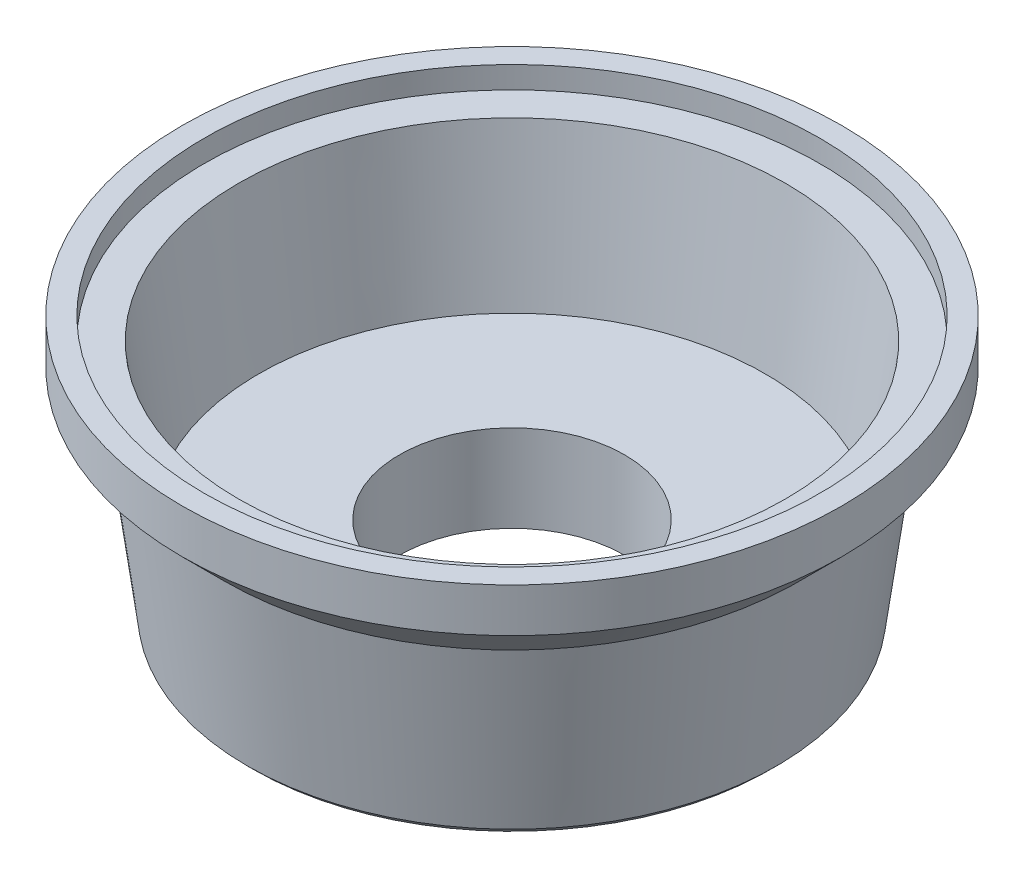
ISO-10303-21;
HEADER;
FILE_DESCRIPTION(('STEP AP214'),'2;1');
FILE_NAME('part.step','',(''),(''),'','','');
FILE_SCHEMA(('AUTOMOTIVE_DESIGN { 1 0 10303 214 1 1 1 1 }'));
ENDSEC;
DATA;
#1=APPLICATION_CONTEXT('core data for automotive mechanical design processes');
#2=APPLICATION_PROTOCOL_DEFINITION('international standard','automotive_design',2000,#1);
#3=PRODUCT_CONTEXT('',#1,'mechanical');
#4=PRODUCT('Part','Part','',(#3));
#5=PRODUCT_RELATED_PRODUCT_CATEGORY('part','',(#4));
#6=PRODUCT_DEFINITION_FORMATION('','',#4);
#7=PRODUCT_DEFINITION_CONTEXT('part definition',#1,'design');
#8=PRODUCT_DEFINITION('design','',#6,#7);
#9=PRODUCT_DEFINITION_SHAPE('','',#8);
#10=(LENGTH_UNIT() NAMED_UNIT(*) SI_UNIT(.MILLI.,.METRE.));
#11=(NAMED_UNIT(*) PLANE_ANGLE_UNIT() SI_UNIT($,.RADIAN.));
#12=(NAMED_UNIT(*) SI_UNIT($,.STERADIAN.) SOLID_ANGLE_UNIT());
#13=UNCERTAINTY_MEASURE_WITH_UNIT(LENGTH_MEASURE(1.E-05),#10,'distance_accuracy_value','');
#14=(GEOMETRIC_REPRESENTATION_CONTEXT(3) GLOBAL_UNCERTAINTY_ASSIGNED_CONTEXT((#13)) GLOBAL_UNIT_ASSIGNED_CONTEXT((#10,
#11,#12)) REPRESENTATION_CONTEXT('',''));
#15=CARTESIAN_POINT('',(0.,0.,0.));
#16=DIRECTION('',(0.,0.,1.));
#17=DIRECTION('',(1.,0.,0.));
#18=AXIS2_PLACEMENT_3D('',#15,#16,#17);
#19=CARTESIAN_POINT('',(0.,0.,0.));
#20=DIRECTION('',(0.,1.,0.));
#21=DIRECTION('',(0.,0.,1.));
#22=AXIS2_PLACEMENT_3D('',#19,#20,#21);
#23=PLANE('',#22);
#24=CARTESIAN_POINT('',(0.,0.,0.));
#25=DIRECTION('',(0.,1.,0.));
#26=DIRECTION('',(0.,0.,1.));
#27=AXIS2_PLACEMENT_3D('',#24,#25,#26);
#28=CIRCLE('',#27,18.6842399999999);
#29=CARTESIAN_POINT('',(0.,0.,18.6842399999999));
#30=VERTEX_POINT('',#29);
#31=EDGE_CURVE('E55',#30,#30,#28,.F.);
#32=ORIENTED_EDGE('',*,*,#31,.T.);
#33=EDGE_LOOP('',(#32));
#34=FACE_BOUND('',#33,.T.);
#35=CARTESIAN_POINT('',(0.,0.,0.));
#36=DIRECTION('',(0.,1.,0.));
#37=DIRECTION('',(0.,0.,1.));
#38=AXIS2_PLACEMENT_3D('',#35,#36,#37);
#39=CIRCLE('',#38,16.27124);
#40=CARTESIAN_POINT('',(0.,0.,16.27124));
#41=VERTEX_POINT('',#40);
#42=EDGE_CURVE('E75',#41,#41,#39,.T.);
#43=ORIENTED_EDGE('',*,*,#42,.T.);
#44=EDGE_LOOP('',(#43));
#45=FACE_BOUND('',#44,.T.);
#46=ADVANCED_FACE('F43',(#34,#45),#23,.F.);
#47=CARTESIAN_POINT('',(0.,0.,0.));
#48=DIRECTION('',(0.,1.,0.));
#49=DIRECTION('',(0.,0.,1.));
#50=AXIS2_PLACEMENT_3D('',#47,#48,#49);
#51=CIRCLE('',#50,37.338);
#52=CARTESIAN_POINT('',(0.,0.,37.338));
#53=VERTEX_POINT('',#52);
#54=EDGE_CURVE('E10',#53,#53,#51,.F.);
#55=ORIENTED_EDGE('',*,*,#54,.T.);
#56=EDGE_LOOP('',(#55));
#57=FACE_BOUND('',#56,.T.);
#58=CARTESIAN_POINT('',(0.,0.,0.));
#59=DIRECTION('',(0.,1.,0.));
#60=DIRECTION('',(0.,0.,1.));
#61=AXIS2_PLACEMENT_3D('',#58,#59,#60);
#62=CIRCLE('',#61,34.8974859273679);
#63=CARTESIAN_POINT('',(0.,0.,34.8974859273679));
#64=VERTEX_POINT('',#63);
#65=EDGE_CURVE('E88',#64,#64,#62,.T.);
#66=ORIENTED_EDGE('',*,*,#65,.T.);
#67=EDGE_LOOP('',(#66));
#68=FACE_BOUND('',#67,.T.);
#69=ADVANCED_FACE('F113',(#57,#68),#23,.F.);
#70=CARTESIAN_POINT('',(0.,0.,0.));
#71=DIRECTION('',(0.,1.,0.));
#72=DIRECTION('',(0.,0.,1.));
#73=AXIS2_PLACEMENT_3D('',#70,#71,#72);
#74=CONICAL_SURFACE('',#73,38.1,0.131177194417784);
#75=CARTESIAN_POINT('',(0.,0.877814265508203,0.));
#76=DIRECTION('',(0.,-1.,0.));
#77=DIRECTION('',(0.,0.,-1.));
#78=AXIS2_PLACEMENT_3D('',#75,#76,#77);
#79=CIRCLE('',#78,38.2158142655082);
#80=CARTESIAN_POINT('',(0.,0.877814265508203,38.2158142655082));
#81=VERTEX_POINT('',#80);
#82=EDGE_CURVE('E51',#81,#81,#79,.F.);
#83=ORIENTED_EDGE('',*,*,#82,.T.);
#84=EDGE_LOOP('',(#83));
#85=FACE_BOUND('',#84,.T.);
#86=CARTESIAN_POINT('',(0.,25.602916077322,0.));
#87=DIRECTION('',(0.,1.,0.));
#88=DIRECTION('',(0.,0.,1.));
#89=AXIS2_PLACEMENT_3D('',#86,#87,#88);
#90=CIRCLE('',#89,41.477916077322);
#91=CARTESIAN_POINT('',(0.,25.602916077322,41.477916077322));
#92=VERTEX_POINT('',#91);
#93=EDGE_CURVE('E94',#92,#92,#90,.F.);
#94=ORIENTED_EDGE('',*,*,#93,.T.);
#95=EDGE_LOOP('',(#94));
#96=FACE_BOUND('',#95,.T.);
#97=ADVANCED_FACE('F111',(#85,#96),#74,.T.);
#98=CARTESIAN_POINT('',(0.,0.,0.));
#99=DIRECTION('',(0.,1.,0.));
#100=DIRECTION('',(0.,0.,1.));
#101=AXIS2_PLACEMENT_3D('',#98,#99,#100);
#102=CYLINDRICAL_SURFACE('',#101,47.625);
#103=CARTESIAN_POINT('',(0.,38.1,0.));
#104=DIRECTION('',(0.,1.,0.));
#105=DIRECTION('',(0.,0.,1.));
#106=AXIS2_PLACEMENT_3D('',#103,#104,#105);
#107=CIRCLE('',#106,47.625);
#108=CARTESIAN_POINT('',(0.,38.1,47.625));
#109=VERTEX_POINT('',#108);
#110=EDGE_CURVE('E67',#109,#109,#107,.T.);
#111=ORIENTED_EDGE('',*,*,#110,.F.);
#112=EDGE_LOOP('',(#111));
#113=FACE_BOUND('',#112,.T.);
#114=CARTESIAN_POINT('',(0.,31.75,0.));
#115=DIRECTION('',(0.,1.,0.));
#116=DIRECTION('',(0.,0.,1.));
#117=AXIS2_PLACEMENT_3D('',#114,#115,#116);
#118=CIRCLE('',#117,47.625);
#119=CARTESIAN_POINT('',(0.,31.75,47.625));
#120=VERTEX_POINT('',#119);
#121=EDGE_CURVE('E97',#120,#120,#118,.T.);
#122=ORIENTED_EDGE('',*,*,#121,.T.);
#123=EDGE_LOOP('',(#122));
#124=FACE_BOUND('',#123,.T.);
#125=ADVANCED_FACE('F101',(#113,#124),#102,.T.);
#126=CARTESIAN_POINT('',(0.,38.1,-47.625));
#127=DIRECTION('',(0.,-1.,0.));
#128=DIRECTION('',(0.,0.,-1.));
#129=AXIS2_PLACEMENT_3D('',#126,#127,#128);
#130=PLANE('',#129);
#131=CARTESIAN_POINT('',(0.,38.1,0.));
#132=DIRECTION('',(0.,-1.,0.));
#133=DIRECTION('',(0.,0.,-1.));
#134=AXIS2_PLACEMENT_3D('',#131,#132,#133);
#135=CIRCLE('',#134,44.45);
#136=CARTESIAN_POINT('',(0.,38.1,-44.45));
#137=VERTEX_POINT('',#136);
#138=EDGE_CURVE('E71',#137,#137,#135,.F.);
#139=ORIENTED_EDGE('',*,*,#138,.F.);
#140=EDGE_LOOP('',(#139));
#141=FACE_BOUND('',#140,.T.);
#142=ORIENTED_EDGE('',*,*,#110,.T.);
#143=EDGE_LOOP('',(#142));
#144=FACE_BOUND('',#143,.T.);
#145=ADVANCED_FACE('F119',(#141,#144),#130,.F.);
#146=CARTESIAN_POINT('',(0.,0.415294170850315,0.));
#147=DIRECTION('',(0.,1.,0.));
#148=DIRECTION('',(0.,0.,1.));
#149=AXIS2_PLACEMENT_3D('',#146,#147,#148);
#150=CONICAL_SURFACE('',#149,34.9522776882867,0.131177194417784);
#151=CARTESIAN_POINT('',(0.,12.5719302661163,0.));
#152=DIRECTION('',(0.,1.,0.));
#153=DIRECTION('',(0.,0.,1.));
#154=AXIS2_PLACEMENT_3D('',#151,#152,#153);
#155=CIRCLE('',#154,36.5561612610929);
#156=CARTESIAN_POINT('',(0.,12.5719302661163,36.5561612610929));
#157=VERTEX_POINT('',#156);
#158=EDGE_CURVE('E64',#157,#157,#155,.T.);
#159=ORIENTED_EDGE('',*,*,#158,.F.);
#160=EDGE_LOOP('',(#159));
#161=FACE_BOUND('',#160,.T.);
#162=CARTESIAN_POINT('',(0.,34.925,0.));
#163=DIRECTION('',(0.,1.,0.));
#164=DIRECTION('',(0.,0.,1.));
#165=AXIS2_PLACEMENT_3D('',#162,#163,#164);
#166=CIRCLE('',#165,39.505309452008);
#167=CARTESIAN_POINT('',(0.,34.925,39.505309452008));
#168=VERTEX_POINT('',#167);
#169=EDGE_CURVE('E70',#168,#168,#166,.T.);
#170=ORIENTED_EDGE('',*,*,#169,.T.);
#171=EDGE_LOOP('',(#170));
#172=FACE_BOUND('',#171,.T.);
#173=ADVANCED_FACE('F170',(#161,#172),#150,.F.);
#174=CARTESIAN_POINT('',(0.,34.925,-42.2889304769456));
#175=DIRECTION('',(0.,1.,0.));
#176=DIRECTION('',(0.,0.,1.));
#177=AXIS2_PLACEMENT_3D('',#174,#175,#176);
#178=PLANE('',#177);
#179=CARTESIAN_POINT('',(0.,34.925,0.));
#180=DIRECTION('',(0.,1.,0.));
#181=DIRECTION('',(0.,0.,1.));
#182=AXIS2_PLACEMENT_3D('',#179,#180,#181);
#183=CIRCLE('',#182,44.45);
#184=CARTESIAN_POINT('',(0.,34.925,44.45));
#185=VERTEX_POINT('',#184);
#186=EDGE_CURVE('E74',#185,#185,#183,.T.);
#187=ORIENTED_EDGE('',*,*,#186,.T.);
#188=EDGE_LOOP('',(#187));
#189=FACE_BOUND('',#188,.T.);
#190=ORIENTED_EDGE('',*,*,#169,.F.);
#191=EDGE_LOOP('',(#190));
#192=FACE_BOUND('',#191,.T.);
#193=ADVANCED_FACE('F173',(#189,#192),#178,.T.);
#194=CARTESIAN_POINT('',(0.,0.,0.));
#195=DIRECTION('',(0.,1.,0.));
#196=DIRECTION('',(0.,0.,1.));
#197=AXIS2_PLACEMENT_3D('',#194,#195,#196);
#198=CYLINDRICAL_SURFACE('',#197,44.45);
#199=ORIENTED_EDGE('',*,*,#138,.T.);
#200=EDGE_LOOP('',(#199));
#201=FACE_BOUND('',#200,.T.);
#202=ORIENTED_EDGE('',*,*,#186,.F.);
#203=EDGE_LOOP('',(#202));
#204=FACE_BOUND('',#203,.T.);
#205=ADVANCED_FACE('F168',(#201,#204),#198,.F.);
#206=CARTESIAN_POINT('',(-37.2773135563836,12.5719302661163,0.));
#207=DIRECTION('',(0.,1.,0.));
#208=DIRECTION('',(0.,0.,1.));
#209=AXIS2_PLACEMENT_3D('',#206,#207,#208);
#210=PLANE('',#209);
#211=CARTESIAN_POINT('',(0.,12.5719302661163,0.));
#212=DIRECTION('',(0.,1.,0.));
#213=DIRECTION('',(0.,0.,1.));
#214=AXIS2_PLACEMENT_3D('',#211,#212,#213);
#215=CIRCLE('',#214,16.27124);
#216=CARTESIAN_POINT('',(0.,12.5719302661163,16.27124));
#217=VERTEX_POINT('',#216);
#218=EDGE_CURVE('E80',#217,#217,#215,.T.);
#219=ORIENTED_EDGE('',*,*,#218,.F.);
#220=EDGE_LOOP('',(#219));
#221=FACE_BOUND('',#220,.T.);
#222=ORIENTED_EDGE('',*,*,#158,.T.);
#223=EDGE_LOOP('',(#222));
#224=FACE_BOUND('',#223,.T.);
#225=ADVANCED_FACE('F164',(#221,#224),#210,.T.);
#226=CARTESIAN_POINT('',(0.,0.,0.));
#227=DIRECTION('',(0.,1.,0.));
#228=DIRECTION('',(0.,0.,1.));
#229=AXIS2_PLACEMENT_3D('',#226,#227,#228);
#230=CYLINDRICAL_SURFACE('',#229,16.27124);
#231=CARTESIAN_POINT('',(0.,0.,16.27124));
#232=CARTESIAN_POINT('',(0.,0.130957606938711,16.27124));
#233=CARTESIAN_POINT('',(0.,0.261915213877422,16.27124));
#234=CARTESIAN_POINT('',(0.,0.523830427754845,16.27124));
#235=CARTESIAN_POINT('',(0.,0.654788034693556,16.27124));
#236=CARTESIAN_POINT('',(0.,0.916703248570978,16.27124));
#237=CARTESIAN_POINT('',(0.,1.04766085550969,16.27124));
#238=CARTESIAN_POINT('',(0.,1.30957606938711,16.27124));
#239=CARTESIAN_POINT('',(0.,1.44053367632582,16.27124));
#240=CARTESIAN_POINT('',(0.,1.70244889020324,16.27124));
#241=CARTESIAN_POINT('',(0.,1.83340649714196,16.27124));
#242=CARTESIAN_POINT('',(0.,2.09532171101938,16.27124));
#243=CARTESIAN_POINT('',(0.,2.22627931795809,16.27124));
#244=CARTESIAN_POINT('',(0.,2.48819453183551,16.27124));
#245=CARTESIAN_POINT('',(0.,2.61915213877422,16.27124));
#246=CARTESIAN_POINT('',(0.,2.88106735265164,16.27124));
#247=CARTESIAN_POINT('',(0.,3.01202495959036,16.27124));
#248=CARTESIAN_POINT('',(0.,3.27394017346778,16.27124));
#249=CARTESIAN_POINT('',(0.,3.40489778040649,16.27124));
#250=CARTESIAN_POINT('',(0.,3.66681299428391,16.27124));
#251=CARTESIAN_POINT('',(0.,3.79777060122262,16.27124));
#252=CARTESIAN_POINT('',(0.,4.05968581510005,16.27124));
#253=CARTESIAN_POINT('',(0.,4.19064342203876,16.27124));
#254=CARTESIAN_POINT('',(0.,4.45255863591618,16.27124));
#255=CARTESIAN_POINT('',(0.,4.58351624285489,16.27124));
#256=CARTESIAN_POINT('',(0.,4.84543145673231,16.27124));
#257=CARTESIAN_POINT('',(0.,4.97638906367102,16.27124));
#258=CARTESIAN_POINT('',(0.,5.23830427754844,16.27124));
#259=CARTESIAN_POINT('',(0.,5.36926188448716,16.27124));
#260=CARTESIAN_POINT('',(0.,5.63117709836458,16.27124));
#261=CARTESIAN_POINT('',(0.,5.76213470530329,16.27124));
#262=CARTESIAN_POINT('',(0.,6.02404991918071,16.27124));
#263=CARTESIAN_POINT('',(0.,6.15500752611942,16.27124));
#264=CARTESIAN_POINT('',(0.,6.41692273999685,16.27124));
#265=CARTESIAN_POINT('',(0.,6.54788034693556,16.27124));
#266=CARTESIAN_POINT('',(0.,6.80979556081298,16.27124));
#267=CARTESIAN_POINT('',(0.,6.94075316775169,16.27124));
#268=CARTESIAN_POINT('',(0.,7.20266838162911,16.27124));
#269=CARTESIAN_POINT('',(0.,7.33362598856782,16.27124));
#270=CARTESIAN_POINT('',(0.,7.59554120244525,16.27124));
#271=CARTESIAN_POINT('',(0.,7.72649880938396,16.27124));
#272=CARTESIAN_POINT('',(0.,7.98841402326138,16.27124));
#273=CARTESIAN_POINT('',(0.,8.11937163020009,16.27124));
#274=CARTESIAN_POINT('',(0.,8.38128684407751,16.27124));
#275=CARTESIAN_POINT('',(0.,8.51224445101622,16.27124));
#276=CARTESIAN_POINT('',(0.,8.77415966489365,16.27124));
#277=CARTESIAN_POINT('',(0.,8.90511727183236,16.27124));
#278=CARTESIAN_POINT('',(0.,9.16703248570978,16.27124));
#279=CARTESIAN_POINT('',(0.,9.29799009264849,16.27124));
#280=CARTESIAN_POINT('',(0.,9.55990530652591,16.27124));
#281=CARTESIAN_POINT('',(0.,9.69086291346462,16.27124));
#282=CARTESIAN_POINT('',(0.,9.95277812734204,16.27124));
#283=CARTESIAN_POINT('',(0.,10.0837357342808,16.27124));
#284=CARTESIAN_POINT('',(0.,10.3456509481582,16.27124));
#285=CARTESIAN_POINT('',(0.,10.4766085550969,16.27124));
#286=CARTESIAN_POINT('',(0.,10.7385237689743,16.27124));
#287=CARTESIAN_POINT('',(0.,10.869481375913,16.27124));
#288=CARTESIAN_POINT('',(0.,11.1313965897904,16.27124));
#289=CARTESIAN_POINT('',(0.,11.2623541967292,16.27124));
#290=CARTESIAN_POINT('',(0.,11.5242694106066,16.27124));
#291=CARTESIAN_POINT('',(0.,11.6552270175453,16.27124));
#292=CARTESIAN_POINT('',(0.,11.9171422314227,16.27124));
#293=CARTESIAN_POINT('',(0.,12.0480998383614,16.27124));
#294=CARTESIAN_POINT('',(0.,12.3100150522388,16.27124));
#295=CARTESIAN_POINT('',(0.,12.4409726591776,16.27124));
#296=CARTESIAN_POINT('',(0.,12.5719302661163,16.27124));
#297=B_SPLINE_CURVE_WITH_KNOTS('',3,(#231,#232,#233,#234,#235,#236,#237,#238,#239,#240,#241,
#242,#243,#244,#245,#246,#247,#248,#249,#250,#251,#252,#253,#254,#255,#256,#257,#258,#259,#260,
#261,#262,#263,#264,#265,#266,#267,#268,#269,#270,#271,#272,#273,#274,#275,#276,#277,#278,#279,
#280,#281,#282,#283,#284,#285,#286,#287,#288,#289,#290,#291,#292,#293,#294,#295,#296),
.UNSPECIFIED.,.F.,.F.,(4,2,2,2,2,2,2,2,2,2,2,2,2,2,2,2,2,2,2,2,2,2,2,2,2,2,2,2,2,2,2,2,4),(0.,
0.392872820816133,0.785745641632267,1.1786184624484,1.57149128326453,1.96436410408067,
2.3572369248968,2.75010974571293,3.14298256652907,3.5358553873452,3.92872820816133,
4.32160102897747,4.7144738497936,5.10734667060973,5.50021949142587,5.893092312242,
6.28596513305813,6.67883795387427,7.0717107746904,7.46458359550653,7.85745641632267,
8.2503292371388,8.64320205795493,9.03607487877107,9.4289476995872,9.82182052040333,
10.2146933412195,10.6075661620356,11.0004389828517,11.3933118036679,11.786184624484,
12.1790574453001,12.5719302661163),.UNSPECIFIED.);
#298=EDGE_CURVE('BSEAM150',#41,#217,#297,.T.);
#299=ORIENTED_EDGE('',*,*,#42,.F.);
#300=ORIENTED_EDGE('',*,*,#218,.T.);
#301=ORIENTED_EDGE('',*,*,#298,.T.);
#302=ORIENTED_EDGE('',*,*,#298,.F.);
#303=EDGE_LOOP('',(#299,#301,#300,#302));
#304=FACE_BOUND('',#303,.T.);
#305=ADVANCED_FACE('F150',(#304),#230,.F.);
#306=CARTESIAN_POINT('',(-37.2773135563836,9.39693026611627,0.));
#307=DIRECTION('',(0.,1.,0.));
#308=DIRECTION('',(0.,0.,1.));
#309=AXIS2_PLACEMENT_3D('',#306,#307,#308);
#310=PLANE('',#309);
#311=CARTESIAN_POINT('',(0.,9.39693026611627,0.));
#312=DIRECTION('',(0.,1.,0.));
#313=DIRECTION('',(0.,0.,1.));
#314=AXIS2_PLACEMENT_3D('',#311,#312,#313);
#315=CIRCLE('',#314,19.44624);
#316=CARTESIAN_POINT('',(0.,9.39693026611627,19.44624));
#317=VERTEX_POINT('',#316);
#318=EDGE_CURVE('E91',#317,#317,#315,.T.);
#319=ORIENTED_EDGE('',*,*,#318,.T.);
#320=EDGE_LOOP('',(#319));
#321=FACE_BOUND('',#320,.T.);
#322=CARTESIAN_POINT('',(0.,9.39693026611627,0.));
#323=DIRECTION('',(0.,1.,0.));
#324=DIRECTION('',(0.,0.,1.));
#325=AXIS2_PLACEMENT_3D('',#322,#323,#324);
#326=CIRCLE('',#325,36.1372682133983);
#327=CARTESIAN_POINT('',(0.,9.39693026611627,36.1372682133983));
#328=VERTEX_POINT('',#327);
#329=EDGE_CURVE('E83',#328,#328,#326,.T.);
#330=ORIENTED_EDGE('',*,*,#329,.F.);
#331=EDGE_LOOP('',(#330));
#332=FACE_BOUND('',#331,.T.);
#333=ADVANCED_FACE('F147',(#321,#332),#310,.F.);
#334=CARTESIAN_POINT('',(0.,0.415294170850315,0.));
#335=DIRECTION('',(0.,1.,0.));
#336=DIRECTION('',(0.,0.,1.));
#337=AXIS2_PLACEMENT_3D('',#334,#335,#336);
#338=CONICAL_SURFACE('',#337,34.9522776882867,0.131177194417784);
#339=ORIENTED_EDGE('',*,*,#329,.T.);
#340=EDGE_LOOP('',(#339));
#341=FACE_BOUND('',#340,.T.);
#342=ORIENTED_EDGE('',*,*,#65,.F.);
#343=EDGE_LOOP('',(#342));
#344=FACE_BOUND('',#343,.T.);
#345=ADVANCED_FACE('F143',(#341,#344),#338,.F.);
#346=CARTESIAN_POINT('',(0.,0.,0.));
#347=DIRECTION('',(0.,1.,0.));
#348=DIRECTION('',(0.,0.,1.));
#349=AXIS2_PLACEMENT_3D('',#346,#347,#348);
#350=CYLINDRICAL_SURFACE('',#349,19.44624);
#351=CARTESIAN_POINT('',(0.,0.762000000000068,0.));
#352=DIRECTION('',(0.,1.,0.));
#353=DIRECTION('',(0.,0.,1.));
#354=AXIS2_PLACEMENT_3D('',#351,#352,#353);
#355=CIRCLE('',#354,19.44624);
#356=CARTESIAN_POINT('',(0.,0.762000000000068,19.44624));
#357=VERTEX_POINT('',#356);
#358=EDGE_CURVE('E59',#357,#357,#355,.T.);
#359=CARTESIAN_POINT('',(0.,0.762000000000068,19.44624));
#360=CARTESIAN_POINT('',(0.,0.851947190272112,19.44624));
#361=CARTESIAN_POINT('',(0.,0.941894380544155,19.44624));
#362=CARTESIAN_POINT('',(0.,1.12178876108824,19.44624));
#363=CARTESIAN_POINT('',(0.,1.21173595136029,19.44624));
#364=CARTESIAN_POINT('',(0.,1.39163033190437,19.44624));
#365=CARTESIAN_POINT('',(0.,1.48157752217642,19.44624));
#366=CARTESIAN_POINT('',(0.,1.66147190272051,19.44624));
#367=CARTESIAN_POINT('',(0.,1.75141909299255,19.44624));
#368=CARTESIAN_POINT('',(0.,1.93131347353664,19.44624));
#369=CARTESIAN_POINT('',(0.,2.02126066380868,19.44624));
#370=CARTESIAN_POINT('',(0.,2.20115504435277,19.44624));
#371=CARTESIAN_POINT('',(0.,2.29110223462481,19.44624));
#372=CARTESIAN_POINT('',(0.,2.4709966151689,19.44624));
#373=CARTESIAN_POINT('',(0.,2.56094380544094,19.44624));
#374=CARTESIAN_POINT('',(0.,2.74083818598503,19.44624));
#375=CARTESIAN_POINT('',(0.,2.83078537625707,19.44624));
#376=CARTESIAN_POINT('',(0.,3.01067975680116,19.44624));
#377=CARTESIAN_POINT('',(0.,3.10062694707321,19.44624));
#378=CARTESIAN_POINT('',(0.,3.28052132761729,19.44624));
#379=CARTESIAN_POINT('',(0.,3.37046851788934,19.44624));
#380=CARTESIAN_POINT('',(0.,3.55036289843342,19.44624));
#381=CARTESIAN_POINT('',(0.,3.64031008870547,19.44624));
#382=CARTESIAN_POINT('',(0.,3.82020446924956,19.44624));
#383=CARTESIAN_POINT('',(0.,3.9101516595216,19.44624));
#384=CARTESIAN_POINT('',(0.,4.09004604006569,19.44624));
#385=CARTESIAN_POINT('',(0.,4.17999323033773,19.44624));
#386=CARTESIAN_POINT('',(0.,4.35988761088182,19.44624));
#387=CARTESIAN_POINT('',(0.,4.44983480115386,19.44624));
#388=CARTESIAN_POINT('',(0.,4.62972918169795,19.44624));
#389=CARTESIAN_POINT('',(0.,4.71967637196999,19.44624));
#390=CARTESIAN_POINT('',(0.,4.89957075251408,19.44624));
#391=CARTESIAN_POINT('',(0.,4.98951794278612,19.44624));
#392=CARTESIAN_POINT('',(0.,5.16941232333021,19.44624));
#393=CARTESIAN_POINT('',(0.,5.25935951360225,19.44624));
#394=CARTESIAN_POINT('',(0.,5.43925389414634,19.44624));
#395=CARTESIAN_POINT('',(0.,5.52920108441839,19.44624));
#396=CARTESIAN_POINT('',(0.,5.70909546496247,19.44624));
#397=CARTESIAN_POINT('',(0.,5.79904265523452,19.44624));
#398=CARTESIAN_POINT('',(0.,5.97893703577861,19.44624));
#399=CARTESIAN_POINT('',(0.,6.06888422605065,19.44624));
#400=CARTESIAN_POINT('',(0.,6.24877860659474,19.44624));
#401=CARTESIAN_POINT('',(0.,6.33872579686678,19.44624));
#402=CARTESIAN_POINT('',(0.,6.51862017741087,19.44624));
#403=CARTESIAN_POINT('',(0.,6.60856736768291,19.44624));
#404=CARTESIAN_POINT('',(0.,6.788461748227,19.44624));
#405=CARTESIAN_POINT('',(0.,6.87840893849904,19.44624));
#406=CARTESIAN_POINT('',(0.,7.05830331904313,19.44624));
#407=CARTESIAN_POINT('',(0.,7.14825050931517,19.44624));
#408=CARTESIAN_POINT('',(0.,7.32814488985926,19.44624));
#409=CARTESIAN_POINT('',(0.,7.41809208013131,19.44624));
#410=CARTESIAN_POINT('',(0.,7.59798646067539,19.44624));
#411=CARTESIAN_POINT('',(0.,7.68793365094744,19.44624));
#412=CARTESIAN_POINT('',(0.,7.86782803149152,19.44624));
#413=CARTESIAN_POINT('',(0.,7.95777522176357,19.44624));
#414=CARTESIAN_POINT('',(0.,8.13766960230766,19.44624));
#415=CARTESIAN_POINT('',(0.,8.2276167925797,19.44624));
#416=CARTESIAN_POINT('',(0.,8.40751117312379,19.44624));
#417=CARTESIAN_POINT('',(0.,8.49745836339583,19.44624));
#418=CARTESIAN_POINT('',(0.,8.67735274393992,19.44624));
#419=CARTESIAN_POINT('',(0.,8.76729993421196,19.44624));
#420=CARTESIAN_POINT('',(0.,8.94719431475605,19.44624));
#421=CARTESIAN_POINT('',(0.,9.03714150502809,19.44624));
#422=CARTESIAN_POINT('',(0.,9.21703588557218,19.44624));
#423=CARTESIAN_POINT('',(0.,9.30698307584422,19.44624));
#424=CARTESIAN_POINT('',(0.,9.39693026611627,19.44624));
#425=B_SPLINE_CURVE_WITH_KNOTS('',3,(#359,#360,#361,#362,#363,#364,#365,#366,#367,#368,#369,
#370,#371,#372,#373,#374,#375,#376,#377,#378,#379,#380,#381,#382,#383,#384,#385,#386,#387,#388,
#389,#390,#391,#392,#393,#394,#395,#396,#397,#398,#399,#400,#401,#402,#403,#404,#405,#406,#407,
#408,#409,#410,#411,#412,#413,#414,#415,#416,#417,#418,#419,#420,#421,#422,#423,#424),
.UNSPECIFIED.,.F.,.F.,(4,2,2,2,2,2,2,2,2,2,2,2,2,2,2,2,2,2,2,2,2,2,2,2,2,2,2,2,2,2,2,2,4),(0.,
0.269841570816131,0.539683141632262,0.809524712448394,1.07936628326453,1.34920785408066,
1.61904942489679,1.88889099571292,2.15873256652905,2.42857413734518,2.69841570816131,
2.96825727897744,3.23809884979358,3.50794042060971,3.77778199142584,4.04762356224197,
4.3174651330581,4.58730670387423,4.85714827469036,5.12698984550649,5.39683141632262,
5.66667298713876,5.93651455795489,6.20635612877102,6.47619769958715,6.74603927040328,
7.01588084121941,7.28572241203554,7.55556398285167,7.8254055536678,8.09524712448394,
8.36508869530007,8.6349302661162),.UNSPECIFIED.);
#426=EDGE_CURVE('BSEAM107',#357,#317,#425,.T.);
#427=ORIENTED_EDGE('',*,*,#358,.T.);
#428=ORIENTED_EDGE('',*,*,#318,.F.);
#429=ORIENTED_EDGE('',*,*,#426,.T.);
#430=ORIENTED_EDGE('',*,*,#426,.F.);
#431=EDGE_LOOP('',(#427,#429,#428,#430));
#432=FACE_BOUND('',#431,.T.);
#433=ADVANCED_FACE('F107',(#432),#350,.T.);
#434=CARTESIAN_POINT('',(0.,31.75,0.));
#435=DIRECTION('',(0.,1.,0.));
#436=DIRECTION('',(0.,0.,1.));
#437=AXIS2_PLACEMENT_3D('',#434,#435,#436);
#438=CONICAL_SURFACE('',#437,47.625,0.785398163397447);
#439=ORIENTED_EDGE('',*,*,#121,.F.);
#440=EDGE_LOOP('',(#439));
#441=FACE_BOUND('',#440,.T.);
#442=ORIENTED_EDGE('',*,*,#93,.F.);
#443=EDGE_LOOP('',(#442));
#444=FACE_BOUND('',#443,.T.);
#445=ADVANCED_FACE('F103',(#441,#444),#438,.T.);
#446=CARTESIAN_POINT('',(0.,0.762000000000068,0.));
#447=DIRECTION('',(0.,1.,0.));
#448=DIRECTION('',(0.,0.,1.));
#449=AXIS2_PLACEMENT_3D('',#446,#447,#448);
#450=CONICAL_SURFACE('',#449,19.44624,0.785398163397448);
#451=ORIENTED_EDGE('',*,*,#31,.F.);
#452=EDGE_LOOP('',(#451));
#453=FACE_BOUND('',#452,.T.);
#454=ORIENTED_EDGE('',*,*,#358,.F.);
#455=EDGE_LOOP('',(#454));
#456=FACE_BOUND('',#455,.T.);
#457=ADVANCED_FACE('F106',(#453,#456),#450,.T.);
#458=CARTESIAN_POINT('',(0.,0.877814265508175,0.));
#459=DIRECTION('',(0.,1.,0.));
#460=DIRECTION('',(0.,0.,1.));
#461=AXIS2_PLACEMENT_3D('',#458,#459,#460);
#462=CONICAL_SURFACE('',#461,38.2158142655082,0.785398163397445);
#463=CARTESIAN_POINT('',(0.,0.,37.338));
#464=CARTESIAN_POINT('',(0.,0.009143898599043,37.3471438985991));
#465=CARTESIAN_POINT('',(0.,0.0182877971980872,37.3562877971981));
#466=CARTESIAN_POINT('',(0.,0.0365755943961755,37.3745755943962));
#467=CARTESIAN_POINT('',(0.,0.0457194929952197,37.3837194929952));
#468=CARTESIAN_POINT('',(0.,0.0640072901933069,37.4020072901933));
#469=CARTESIAN_POINT('',(0.,0.0731511887923498,37.4111511887924));
#470=CARTESIAN_POINT('',(0.,0.0914389859904371,37.4294389859905));
#471=CARTESIAN_POINT('',(0.,0.100582884589481,37.4385828845895));
#472=CARTESIAN_POINT('',(0.,0.118870681787569,37.4568706817876));
#473=CARTESIAN_POINT('',(0.,0.128014580386613,37.4660145803866));
#474=CARTESIAN_POINT('',(0.,0.146302377584701,37.4843023775847));
#475=CARTESIAN_POINT('',(0.,0.155446276183745,37.4934462761838));
#476=CARTESIAN_POINT('',(0.,0.173734073381832,37.5117340733818));
#477=CARTESIAN_POINT('',(0.,0.182877971980875,37.5208779719809));
#478=CARTESIAN_POINT('',(0.,0.201165769178963,37.539165769179));
#479=CARTESIAN_POINT('',(0.,0.210309667778007,37.548309667778));
#480=CARTESIAN_POINT('',(0.,0.228597464976095,37.5665974649761));
#481=CARTESIAN_POINT('',(0.,0.237741363575139,37.5757413635752));
#482=CARTESIAN_POINT('',(0.,0.256029160773226,37.5940291607732));
#483=CARTESIAN_POINT('',(0.,0.26517305937227,37.6031730593723));
#484=CARTESIAN_POINT('',(0.,0.283460856570358,37.6214608565704));
#485=CARTESIAN_POINT('',(0.,0.292604755169402,37.6306047551694));
#486=CARTESIAN_POINT('',(0.,0.310892552367489,37.6488925523675));
#487=CARTESIAN_POINT('',(0.,0.320036450966532,37.6580364509665));
#488=CARTESIAN_POINT('',(0.,0.338324248164619,37.6763242481646));
#489=CARTESIAN_POINT('',(0.,0.347468146763664,37.6854681467637));
#490=CARTESIAN_POINT('',(0.,0.365755943961752,37.7037559439618));
#491=CARTESIAN_POINT('',(0.,0.374899842560795,37.7128998425608));
#492=CARTESIAN_POINT('',(0.,0.393187639758883,37.7311876397589));
#493=CARTESIAN_POINT('',(0.,0.402331538357926,37.7403315383579));
#494=CARTESIAN_POINT('',(0.,0.420619335556014,37.758619335556));
#495=CARTESIAN_POINT('',(0.,0.429763234155059,37.7677632341551));
#496=CARTESIAN_POINT('',(0.,0.448051031353146,37.7860510313532));
#497=CARTESIAN_POINT('',(0.,0.457194929952189,37.7951949299522));
#498=CARTESIAN_POINT('',(0.,0.475482727150276,37.8134827271503));
#499=CARTESIAN_POINT('',(0.,0.48462662574932,37.8226266257493));
#500=CARTESIAN_POINT('',(0.,0.502914422947408,37.8409144229474));
#501=CARTESIAN_POINT('',(0.,0.512058321546452,37.8500583215465));
#502=CARTESIAN_POINT('',(0.,0.53034611874454,37.8683461187446));
#503=CARTESIAN_POINT('',(0.,0.539490017343584,37.8774900173436));
#504=CARTESIAN_POINT('',(0.,0.557777814541671,37.8957778145417));
#505=CARTESIAN_POINT('',(0.,0.566921713140714,37.9049217131407));
#506=CARTESIAN_POINT('',(0.,0.585209510338801,37.9232095103388));
#507=CARTESIAN_POINT('',(0.,0.594353408937846,37.9323534089379));
#508=CARTESIAN_POINT('',(0.,0.612641206135934,37.9506412061359));
#509=CARTESIAN_POINT('',(0.,0.621785104734977,37.959785104735));
#510=CARTESIAN_POINT('',(0.,0.640072901933065,37.9780729019331));
#511=CARTESIAN_POINT('',(0.,0.649216800532109,37.9872168005321));
#512=CARTESIAN_POINT('',(0.,0.667504597730196,38.0055045977302));
#513=CARTESIAN_POINT('',(0.,0.676648496329241,38.0146484963292));
#514=CARTESIAN_POINT('',(0.,0.694936293527328,38.0329362935273));
#515=CARTESIAN_POINT('',(0.,0.704080192126371,38.0420801921264));
#516=CARTESIAN_POINT('',(0.,0.722367989324458,38.0603679893245));
#517=CARTESIAN_POINT('',(0.,0.731511887923503,38.0695118879235));
#518=CARTESIAN_POINT('',(0.,0.74979968512159,38.0877996851216));
#519=CARTESIAN_POINT('',(0.,0.758943583720634,38.0969435837206));
#520=CARTESIAN_POINT('',(0.,0.777231380918722,38.1152313809187));
#521=CARTESIAN_POINT('',(0.,0.786375279517766,38.1243752795178));
#522=CARTESIAN_POINT('',(0.,0.804663076715853,38.1426630767159));
#523=CARTESIAN_POINT('',(0.,0.813806975314896,38.1518069753149));
#524=CARTESIAN_POINT('',(0.,0.832094772512984,38.170094772513));
#525=CARTESIAN_POINT('',(0.,0.841238671112028,38.179238671112));
#526=CARTESIAN_POINT('',(0.,0.859526468310116,38.1975264683101));
#527=CARTESIAN_POINT('',(0.,0.86867036690916,38.2066703669092));
#528=CARTESIAN_POINT('',(0.,0.877814265508203,38.2158142655082));
#529=B_SPLINE_CURVE_WITH_KNOTS('',3,(#463,#464,#465,#466,#467,#468,#469,#470,#471,#472,#473,
#474,#475,#476,#477,#478,#479,#480,#481,#482,#483,#484,#485,#486,#487,#488,#489,#490,#491,#492,
#493,#494,#495,#496,#497,#498,#499,#500,#501,#502,#503,#504,#505,#506,#507,#508,#509,#510,#511,
#512,#513,#514,#515,#516,#517,#518,#519,#520,#521,#522,#523,#524,#525,#526,#527,#528),
.UNSPECIFIED.,.F.,.F.,(4,2,2,2,2,2,2,2,2,2,2,2,2,2,2,2,2,2,2,2,2,2,2,2,2,2,2,2,2,2,2,2,4),(0.,
0.038794276235195,0.0775885524703899,0.11638282870559,0.155177104940785,0.19397138117598,
0.232765657411175,0.271559933646375,0.31035420988157,0.349148486116764,0.387942762351959,
0.426737038587154,0.465531314822354,0.504325591057549,0.543119867292744,0.581914143527939,
0.620708419763134,0.659502695998334,0.698296972233529,0.737091248468724,0.775885524703919,
0.814679800939119,0.853474077174314,0.892268353409509,0.931062629644704,0.969856905879899,
1.0086511821151,1.04744545835029,1.08623973458549,1.12503401082068,1.16382828705588,
1.20262256329108,1.24141683952627),.UNSPECIFIED.);
#530=EDGE_CURVE('BSEAM46',#53,#81,#529,.T.);
#531=ORIENTED_EDGE('',*,*,#54,.F.);
#532=ORIENTED_EDGE('',*,*,#82,.F.);
#533=ORIENTED_EDGE('',*,*,#530,.T.);
#534=ORIENTED_EDGE('',*,*,#530,.F.);
#535=EDGE_LOOP('',(#531,#533,#532,#534));
#536=FACE_BOUND('',#535,.T.);
#537=ADVANCED_FACE('F46',(#536),#462,.T.);
#538=CLOSED_SHELL('',(#46,#69,#97,#125,#145,#173,#193,#205,#225,#305,#333,#345,#433,#445,#457,#537));
#539=MANIFOLD_SOLID_BREP('B2',#538);
#540=ADVANCED_BREP_SHAPE_REPRESENTATION('',(#18,#539),#14);
#541=SHAPE_DEFINITION_REPRESENTATION(#9,#540);
ENDSEC;
END-ISO-10303-21;
